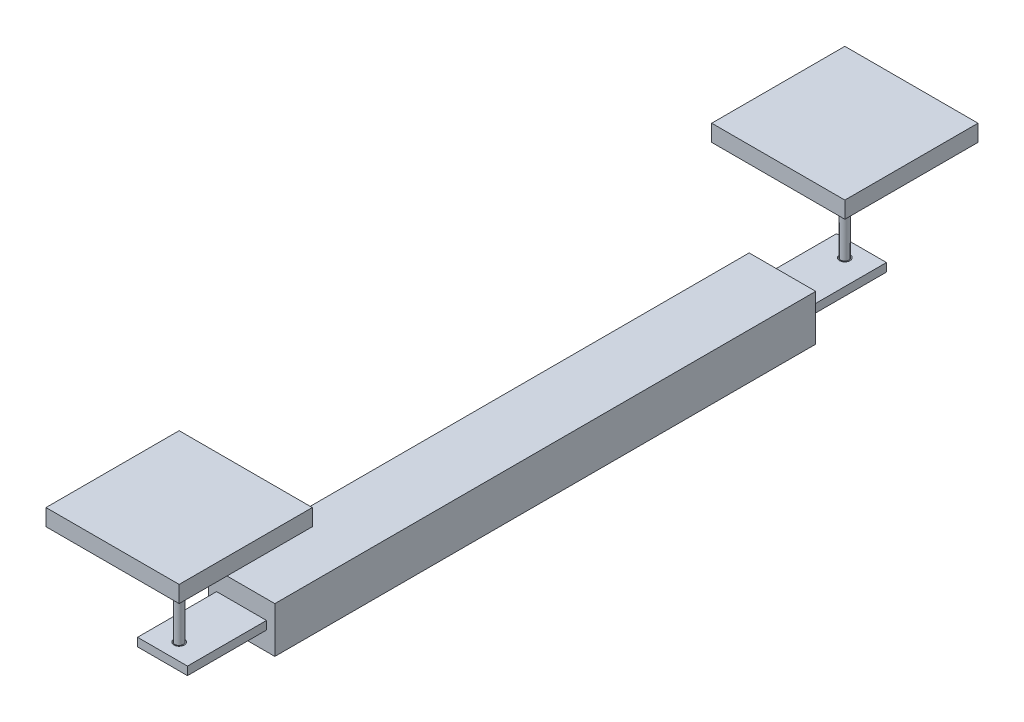
ISO-10303-21;
HEADER;
FILE_DESCRIPTION(('STEP AP214'),'2;1');
FILE_NAME('part.step','',(''),(''),'','','');
FILE_SCHEMA(('AUTOMOTIVE_DESIGN { 1 0 10303 214 1 1 1 1 }'));
ENDSEC;
DATA;
#1=APPLICATION_CONTEXT('core data for automotive mechanical design processes');
#2=APPLICATION_PROTOCOL_DEFINITION('international standard','automotive_design',2000,#1);
#3=PRODUCT_CONTEXT('',#1,'mechanical');
#4=PRODUCT('Part','Part','',(#3));
#5=PRODUCT_RELATED_PRODUCT_CATEGORY('part','',(#4));
#6=PRODUCT_DEFINITION_FORMATION('','',#4);
#7=PRODUCT_DEFINITION_CONTEXT('part definition',#1,'design');
#8=PRODUCT_DEFINITION('design','',#6,#7);
#9=PRODUCT_DEFINITION_SHAPE('','',#8);
#10=(LENGTH_UNIT() NAMED_UNIT(*) SI_UNIT(.MILLI.,.METRE.));
#11=(NAMED_UNIT(*) PLANE_ANGLE_UNIT() SI_UNIT($,.RADIAN.));
#12=(NAMED_UNIT(*) SI_UNIT($,.STERADIAN.) SOLID_ANGLE_UNIT());
#13=UNCERTAINTY_MEASURE_WITH_UNIT(LENGTH_MEASURE(1.E-05),#10,'distance_accuracy_value','');
#14=(GEOMETRIC_REPRESENTATION_CONTEXT(3) GLOBAL_UNCERTAINTY_ASSIGNED_CONTEXT((#13)) GLOBAL_UNIT_ASSIGNED_CONTEXT((#10,
#11,#12)) REPRESENTATION_CONTEXT('',''));
#15=CARTESIAN_POINT('',(0.,0.,0.));
#16=DIRECTION('',(0.,0.,1.));
#17=DIRECTION('',(1.,0.,0.));
#18=AXIS2_PLACEMENT_3D('',#15,#16,#17);
#19=CARTESIAN_POINT('',(0.,79.375,254.));
#20=DIRECTION('',(0.,-1.,0.));
#21=DIRECTION('',(0.,0.,-1.));
#22=AXIS2_PLACEMENT_3D('',#19,#20,#21);
#23=CYLINDRICAL_SURFACE('',#22,3.175);
#24=CARTESIAN_POINT('',(0.,79.375,254.));
#25=DIRECTION('',(0.,1.,0.));
#26=DIRECTION('',(0.,0.,1.));
#27=AXIS2_PLACEMENT_3D('',#24,#25,#26);
#28=CIRCLE('',#27,3.175);
#29=CARTESIAN_POINT('',(0.,79.375,250.825));
#30=VERTEX_POINT('',#29);
#31=EDGE_CURVE('E12',#30,#30,#28,.T.);
#32=CARTESIAN_POINT('',(0.,3.175,254.));
#33=DIRECTION('',(0.,1.,0.));
#34=DIRECTION('',(0.,0.,1.));
#35=AXIS2_PLACEMENT_3D('',#32,#33,#34);
#36=CIRCLE('',#35,3.175);
#37=CARTESIAN_POINT('',(0.,3.175,250.825));
#38=VERTEX_POINT('',#37);
#39=EDGE_CURVE('E53',#38,#38,#36,.T.);
#40=CARTESIAN_POINT('',(0.,79.375,250.825));
#41=CARTESIAN_POINT('',(0.,78.58125,250.825));
#42=CARTESIAN_POINT('',(0.,77.7875,250.825));
#43=CARTESIAN_POINT('',(0.,76.2,250.825));
#44=CARTESIAN_POINT('',(0.,75.40625,250.825));
#45=CARTESIAN_POINT('',(0.,73.81875,250.825));
#46=CARTESIAN_POINT('',(0.,73.025,250.825));
#47=CARTESIAN_POINT('',(0.,71.4375,250.825));
#48=CARTESIAN_POINT('',(0.,70.64375,250.825));
#49=CARTESIAN_POINT('',(0.,69.05625,250.825));
#50=CARTESIAN_POINT('',(0.,68.2625,250.825));
#51=CARTESIAN_POINT('',(0.,66.675,250.825));
#52=CARTESIAN_POINT('',(0.,65.88125,250.825));
#53=CARTESIAN_POINT('',(0.,64.29375,250.825));
#54=CARTESIAN_POINT('',(0.,63.5,250.825));
#55=CARTESIAN_POINT('',(0.,61.9125,250.825));
#56=CARTESIAN_POINT('',(0.,61.11875,250.825));
#57=CARTESIAN_POINT('',(0.,59.53125,250.825));
#58=CARTESIAN_POINT('',(0.,58.7375,250.825));
#59=CARTESIAN_POINT('',(0.,57.15,250.825));
#60=CARTESIAN_POINT('',(0.,56.35625,250.825));
#61=CARTESIAN_POINT('',(0.,54.76875,250.825));
#62=CARTESIAN_POINT('',(0.,53.975,250.825));
#63=CARTESIAN_POINT('',(0.,52.3875,250.825));
#64=CARTESIAN_POINT('',(0.,51.59375,250.825));
#65=CARTESIAN_POINT('',(0.,50.00625,250.825));
#66=CARTESIAN_POINT('',(0.,49.2125,250.825));
#67=CARTESIAN_POINT('',(0.,47.625,250.825));
#68=CARTESIAN_POINT('',(0.,46.83125,250.825));
#69=CARTESIAN_POINT('',(0.,45.24375,250.825));
#70=CARTESIAN_POINT('',(0.,44.45,250.825));
#71=CARTESIAN_POINT('',(0.,42.8625,250.825));
#72=CARTESIAN_POINT('',(0.,42.06875,250.825));
#73=CARTESIAN_POINT('',(0.,40.48125,250.825));
#74=CARTESIAN_POINT('',(0.,39.6875,250.825));
#75=CARTESIAN_POINT('',(0.,38.1,250.825));
#76=CARTESIAN_POINT('',(0.,37.30625,250.825));
#77=CARTESIAN_POINT('',(0.,35.71875,250.825));
#78=CARTESIAN_POINT('',(0.,34.925,250.825));
#79=CARTESIAN_POINT('',(0.,33.3375,250.825));
#80=CARTESIAN_POINT('',(0.,32.54375,250.825));
#81=CARTESIAN_POINT('',(0.,30.95625,250.825));
#82=CARTESIAN_POINT('',(0.,30.1625,250.825));
#83=CARTESIAN_POINT('',(0.,28.575,250.825));
#84=CARTESIAN_POINT('',(0.,27.78125,250.825));
#85=CARTESIAN_POINT('',(0.,26.19375,250.825));
#86=CARTESIAN_POINT('',(0.,25.4,250.825));
#87=CARTESIAN_POINT('',(0.,23.8125,250.825));
#88=CARTESIAN_POINT('',(0.,23.01875,250.825));
#89=CARTESIAN_POINT('',(0.,21.43125,250.825));
#90=CARTESIAN_POINT('',(0.,20.6375,250.825));
#91=CARTESIAN_POINT('',(0.,19.05,250.825));
#92=CARTESIAN_POINT('',(0.,18.25625,250.825));
#93=CARTESIAN_POINT('',(0.,16.66875,250.825));
#94=CARTESIAN_POINT('',(0.,15.875,250.825));
#95=CARTESIAN_POINT('',(0.,14.2875,250.825));
#96=CARTESIAN_POINT('',(0.,13.49375,250.825));
#97=CARTESIAN_POINT('',(0.,11.90625,250.825));
#98=CARTESIAN_POINT('',(0.,11.1125,250.825));
#99=CARTESIAN_POINT('',(0.,9.525,250.825));
#100=CARTESIAN_POINT('',(0.,8.73125,250.825));
#101=CARTESIAN_POINT('',(0.,7.14375,250.825));
#102=CARTESIAN_POINT('',(0.,6.35,250.825));
#103=CARTESIAN_POINT('',(0.,4.7625,250.825));
#104=CARTESIAN_POINT('',(0.,3.96875,250.825));
#105=CARTESIAN_POINT('',(0.,3.175,250.825));
#106=B_SPLINE_CURVE_WITH_KNOTS('',3,(#40,#41,#42,#43,#44,#45,#46,#47,#48,#49,#50,#51,#52,#53,
#54,#55,#56,#57,#58,#59,#60,#61,#62,#63,#64,#65,#66,#67,#68,#69,#70,#71,#72,#73,#74,#75,#76,#77,
#78,#79,#80,#81,#82,#83,#84,#85,#86,#87,#88,#89,#90,#91,#92,#93,#94,#95,#96,#97,#98,#99,#100,
#101,#102,#103,#104,#105),.UNSPECIFIED.,.F.,.F.,(4,2,2,2,2,2,2,2,2,2,2,2,2,2,2,2,2,2,2,2,2,2,2,
2,2,2,2,2,2,2,2,2,4),(0.,2.38125,4.7625,7.14375,9.52500000000001,11.90625,14.2875,16.66875,
19.05,21.43125,23.8125,26.19375,28.575,30.95625,33.3375,35.71875,38.1,40.48125,42.8625,45.24375,
47.625,50.00625,52.3875,54.76875,57.15,59.53125,61.9125,64.29375,66.675,69.05625,71.4375,
73.81875,76.2),.UNSPECIFIED.);
#107=EDGE_CURVE('BSEAM50',#30,#38,#106,.T.);
#108=ORIENTED_EDGE('',*,*,#31,.F.);
#109=ORIENTED_EDGE('',*,*,#39,.T.);
#110=ORIENTED_EDGE('',*,*,#107,.T.);
#111=ORIENTED_EDGE('',*,*,#107,.F.);
#112=EDGE_LOOP('',(#108,#110,#109,#111));
#113=FACE_BOUND('',#112,.T.);
#114=ADVANCED_FACE('F50',(#113),#23,.T.);
#115=CARTESIAN_POINT('',(0.,3.175,254.));
#116=DIRECTION('',(0.,1.,0.));
#117=DIRECTION('',(0.,0.,1.));
#118=AXIS2_PLACEMENT_3D('',#115,#116,#117);
#119=PLANE('',#118);
#120=ORIENTED_EDGE('',*,*,#39,.F.);
#121=EDGE_LOOP('',(#120));
#122=FACE_BOUND('',#121,.T.);
#123=ADVANCED_FACE('F129',(#122),#119,.F.);
#124=CARTESIAN_POINT('',(50.8,92.075,203.2));
#125=DIRECTION('',(-1.,0.,0.));
#126=DIRECTION('',(0.,0.,1.));
#127=AXIS2_PLACEMENT_3D('',#124,#125,#126);
#128=PLANE('',#127);
#129=DIRECTION('',(0.,0.,-1.));
#130=VECTOR('',#129,1.);
#131=CARTESIAN_POINT('',(50.8,79.375,203.2));
#132=LINE('',#131,#130);
#133=CARTESIAN_POINT('',(50.8,79.375,304.8));
#134=VERTEX_POINT('',#133);
#135=CARTESIAN_POINT('',(50.8,79.375,203.2));
#136=VERTEX_POINT('',#135);
#137=EDGE_CURVE('E117',#134,#136,#132,.T.);
#138=ORIENTED_EDGE('',*,*,#137,.T.);
#139=DIRECTION('',(0.,-1.,0.));
#140=VECTOR('',#139,1.);
#141=CARTESIAN_POINT('',(50.8,92.075,203.2));
#142=LINE('',#141,#140);
#143=CARTESIAN_POINT('',(50.8,92.075,203.2));
#144=VERTEX_POINT('',#143);
#145=EDGE_CURVE('E108',#144,#136,#142,.T.);
#146=ORIENTED_EDGE('',*,*,#145,.F.);
#147=DIRECTION('',(0.,0.,-1.));
#148=VECTOR('',#147,1.);
#149=CARTESIAN_POINT('',(50.8,92.075,203.2));
#150=LINE('',#149,#148);
#151=CARTESIAN_POINT('',(50.8,92.075,304.8));
#152=VERTEX_POINT('',#151);
#153=EDGE_CURVE('E102',#152,#144,#150,.T.);
#154=ORIENTED_EDGE('',*,*,#153,.F.);
#155=DIRECTION('',(0.,-1.,0.));
#156=VECTOR('',#155,1.);
#157=CARTESIAN_POINT('',(50.8,92.075,304.8));
#158=LINE('',#157,#156);
#159=EDGE_CURVE('E113',#152,#134,#158,.T.);
#160=ORIENTED_EDGE('',*,*,#159,.T.);
#161=EDGE_LOOP('',(#138,#146,#154,#160));
#162=FACE_BOUND('',#161,.T.);
#163=ADVANCED_FACE('F131',(#162),#128,.F.);
#164=CARTESIAN_POINT('',(-50.7999999999999,92.075,203.2));
#165=DIRECTION('',(0.,0.,1.));
#166=DIRECTION('',(1.,0.,0.));
#167=AXIS2_PLACEMENT_3D('',#164,#165,#166);
#168=PLANE('',#167);
#169=DIRECTION('',(-1.,0.,0.));
#170=VECTOR('',#169,1.);
#171=CARTESIAN_POINT('',(-50.7999999999999,79.375,203.2));
#172=LINE('',#171,#170);
#173=CARTESIAN_POINT('',(-50.7999999999999,79.375,203.2));
#174=VERTEX_POINT('',#173);
#175=EDGE_CURVE('E107',#136,#174,#172,.T.);
#176=ORIENTED_EDGE('',*,*,#175,.T.);
#177=DIRECTION('',(0.,-1.,0.));
#178=VECTOR('',#177,1.);
#179=CARTESIAN_POINT('',(-50.7999999999999,92.075,203.2));
#180=LINE('',#179,#178);
#181=CARTESIAN_POINT('',(-50.7999999999999,92.075,203.2));
#182=VERTEX_POINT('',#181);
#183=EDGE_CURVE('E105',#182,#174,#180,.T.);
#184=ORIENTED_EDGE('',*,*,#183,.F.);
#185=DIRECTION('',(-1.,0.,0.));
#186=VECTOR('',#185,1.);
#187=CARTESIAN_POINT('',(-50.7999999999999,92.075,203.2));
#188=LINE('',#187,#186);
#189=EDGE_CURVE('E97',#144,#182,#188,.T.);
#190=ORIENTED_EDGE('',*,*,#189,.F.);
#191=ORIENTED_EDGE('',*,*,#145,.T.);
#192=EDGE_LOOP('',(#176,#184,#190,#191));
#193=FACE_BOUND('',#192,.T.);
#194=ADVANCED_FACE('F106',(#193),#168,.F.);
#195=CARTESIAN_POINT('',(-50.7999999999999,92.075,203.2));
#196=DIRECTION('',(1.,0.,0.));
#197=DIRECTION('',(0.,0.,-1.));
#198=AXIS2_PLACEMENT_3D('',#195,#196,#197);
#199=PLANE('',#198);
#200=DIRECTION('',(0.,0.,1.));
#201=VECTOR('',#200,1.);
#202=CARTESIAN_POINT('',(-50.7999999999999,79.375,203.2));
#203=LINE('',#202,#201);
#204=CARTESIAN_POINT('',(-50.7999999999999,79.375,304.8));
#205=VERTEX_POINT('',#204);
#206=EDGE_CURVE('E83',#174,#205,#203,.T.);
#207=ORIENTED_EDGE('',*,*,#206,.T.);
#208=DIRECTION('',(0.,-1.,0.));
#209=VECTOR('',#208,1.);
#210=CARTESIAN_POINT('',(-50.7999999999999,92.075,304.8));
#211=LINE('',#210,#209);
#212=CARTESIAN_POINT('',(-50.7999999999999,92.075,304.8));
#213=VERTEX_POINT('',#212);
#214=EDGE_CURVE('E109',#213,#205,#211,.T.);
#215=ORIENTED_EDGE('',*,*,#214,.F.);
#216=DIRECTION('',(0.,0.,1.));
#217=VECTOR('',#216,1.);
#218=CARTESIAN_POINT('',(-50.7999999999999,92.075,203.2));
#219=LINE('',#218,#217);
#220=EDGE_CURVE('E100',#182,#213,#219,.T.);
#221=ORIENTED_EDGE('',*,*,#220,.F.);
#222=ORIENTED_EDGE('',*,*,#183,.T.);
#223=EDGE_LOOP('',(#207,#215,#221,#222));
#224=FACE_BOUND('',#223,.T.);
#225=ADVANCED_FACE('F111',(#224),#199,.F.);
#226=CARTESIAN_POINT('',(-50.7999999999999,92.075,304.8));
#227=DIRECTION('',(0.,0.,-1.));
#228=DIRECTION('',(-1.,0.,0.));
#229=AXIS2_PLACEMENT_3D('',#226,#227,#228);
#230=PLANE('',#229);
#231=DIRECTION('',(1.,0.,0.));
#232=VECTOR('',#231,1.);
#233=CARTESIAN_POINT('',(-50.7999999999999,79.375,304.8));
#234=LINE('',#233,#232);
#235=EDGE_CURVE('E89',#205,#134,#234,.T.);
#236=ORIENTED_EDGE('',*,*,#235,.T.);
#237=ORIENTED_EDGE('',*,*,#159,.F.);
#238=DIRECTION('',(1.,0.,0.));
#239=VECTOR('',#238,1.);
#240=CARTESIAN_POINT('',(-50.7999999999999,92.075,304.8));
#241=LINE('',#240,#239);
#242=EDGE_CURVE('E66',#213,#152,#241,.T.);
#243=ORIENTED_EDGE('',*,*,#242,.F.);
#244=ORIENTED_EDGE('',*,*,#214,.T.);
#245=EDGE_LOOP('',(#236,#237,#243,#244));
#246=FACE_BOUND('',#245,.T.);
#247=ADVANCED_FACE('F144',(#246),#230,.F.);
#248=CARTESIAN_POINT('',(0.,92.075,0.));
#249=DIRECTION('',(0.,1.,0.));
#250=DIRECTION('',(0.,0.,1.));
#251=AXIS2_PLACEMENT_3D('',#248,#249,#250);
#252=PLANE('',#251);
#253=ORIENTED_EDGE('',*,*,#153,.T.);
#254=ORIENTED_EDGE('',*,*,#189,.T.);
#255=ORIENTED_EDGE('',*,*,#220,.T.);
#256=ORIENTED_EDGE('',*,*,#242,.T.);
#257=EDGE_LOOP('',(#253,#254,#255,#256));
#258=FACE_BOUND('',#257,.T.);
#259=ADVANCED_FACE('F98',(#258),#252,.T.);
#260=CARTESIAN_POINT('',(0.,79.375,0.));
#261=DIRECTION('',(0.,1.,0.));
#262=DIRECTION('',(0.,0.,1.));
#263=AXIS2_PLACEMENT_3D('',#260,#261,#262);
#264=PLANE('',#263);
#265=ORIENTED_EDGE('',*,*,#31,.T.);
#266=EDGE_LOOP('',(#265));
#267=FACE_BOUND('',#266,.T.);
#268=ORIENTED_EDGE('',*,*,#137,.F.);
#269=ORIENTED_EDGE('',*,*,#235,.F.);
#270=ORIENTED_EDGE('',*,*,#206,.F.);
#271=ORIENTED_EDGE('',*,*,#175,.F.);
#272=EDGE_LOOP('',(#268,#269,#270,#271));
#273=FACE_BOUND('',#272,.T.);
#274=ADVANCED_FACE('F147',(#267,#273),#264,.F.);
#275=CLOSED_SHELL('',(#114,#123,#163,#194,#225,#247,#259,#274));
#276=MANIFOLD_SOLID_BREP('B2',#275);
#277=CARTESIAN_POINT('',(0.,79.375,-254.));
#278=DIRECTION('',(0.,-1.,0.));
#279=DIRECTION('',(0.,0.,-1.));
#280=AXIS2_PLACEMENT_3D('',#277,#278,#279);
#281=CYLINDRICAL_SURFACE('',#280,3.175);
#282=CARTESIAN_POINT('',(0.,79.375,-254.));
#283=DIRECTION('',(0.,1.,0.));
#284=DIRECTION('',(0.,0.,1.));
#285=AXIS2_PLACEMENT_3D('',#282,#283,#284);
#286=CIRCLE('',#285,3.175);
#287=CARTESIAN_POINT('',(0.,79.375,-257.175));
#288=VERTEX_POINT('',#287);
#289=EDGE_CURVE('E48',#288,#288,#286,.T.);
#290=CARTESIAN_POINT('',(0.,3.175,-254.));
#291=DIRECTION('',(0.,1.,0.));
#292=DIRECTION('',(0.,0.,1.));
#293=AXIS2_PLACEMENT_3D('',#290,#291,#292);
#294=CIRCLE('',#293,3.175);
#295=CARTESIAN_POINT('',(0.,3.175,-257.175));
#296=VERTEX_POINT('',#295);
#297=EDGE_CURVE('E216',#296,#296,#294,.T.);
#298=CARTESIAN_POINT('',(0.,79.375,-257.175));
#299=CARTESIAN_POINT('',(0.,78.58125,-257.175));
#300=CARTESIAN_POINT('',(0.,77.7875,-257.175));
#301=CARTESIAN_POINT('',(0.,76.2,-257.175));
#302=CARTESIAN_POINT('',(0.,75.40625,-257.175));
#303=CARTESIAN_POINT('',(0.,73.81875,-257.175));
#304=CARTESIAN_POINT('',(0.,73.025,-257.175));
#305=CARTESIAN_POINT('',(0.,71.4375,-257.175));
#306=CARTESIAN_POINT('',(0.,70.64375,-257.175));
#307=CARTESIAN_POINT('',(0.,69.05625,-257.175));
#308=CARTESIAN_POINT('',(0.,68.2625,-257.175));
#309=CARTESIAN_POINT('',(0.,66.675,-257.175));
#310=CARTESIAN_POINT('',(0.,65.88125,-257.175));
#311=CARTESIAN_POINT('',(0.,64.29375,-257.175));
#312=CARTESIAN_POINT('',(0.,63.5,-257.175));
#313=CARTESIAN_POINT('',(0.,61.9125,-257.175));
#314=CARTESIAN_POINT('',(0.,61.11875,-257.175));
#315=CARTESIAN_POINT('',(0.,59.53125,-257.175));
#316=CARTESIAN_POINT('',(0.,58.7375,-257.175));
#317=CARTESIAN_POINT('',(0.,57.15,-257.175));
#318=CARTESIAN_POINT('',(0.,56.35625,-257.175));
#319=CARTESIAN_POINT('',(0.,54.76875,-257.175));
#320=CARTESIAN_POINT('',(0.,53.975,-257.175));
#321=CARTESIAN_POINT('',(0.,52.3875,-257.175));
#322=CARTESIAN_POINT('',(0.,51.59375,-257.175));
#323=CARTESIAN_POINT('',(0.,50.00625,-257.175));
#324=CARTESIAN_POINT('',(0.,49.2125,-257.175));
#325=CARTESIAN_POINT('',(0.,47.625,-257.175));
#326=CARTESIAN_POINT('',(0.,46.83125,-257.175));
#327=CARTESIAN_POINT('',(0.,45.24375,-257.175));
#328=CARTESIAN_POINT('',(0.,44.45,-257.175));
#329=CARTESIAN_POINT('',(0.,42.8625,-257.175));
#330=CARTESIAN_POINT('',(0.,42.06875,-257.175));
#331=CARTESIAN_POINT('',(0.,40.48125,-257.175));
#332=CARTESIAN_POINT('',(0.,39.6875,-257.175));
#333=CARTESIAN_POINT('',(0.,38.1,-257.175));
#334=CARTESIAN_POINT('',(0.,37.30625,-257.175));
#335=CARTESIAN_POINT('',(0.,35.71875,-257.175));
#336=CARTESIAN_POINT('',(0.,34.925,-257.175));
#337=CARTESIAN_POINT('',(0.,33.3375,-257.175));
#338=CARTESIAN_POINT('',(0.,32.54375,-257.175));
#339=CARTESIAN_POINT('',(0.,30.95625,-257.175));
#340=CARTESIAN_POINT('',(0.,30.1625,-257.175));
#341=CARTESIAN_POINT('',(0.,28.575,-257.175));
#342=CARTESIAN_POINT('',(0.,27.78125,-257.175));
#343=CARTESIAN_POINT('',(0.,26.19375,-257.175));
#344=CARTESIAN_POINT('',(0.,25.4,-257.175));
#345=CARTESIAN_POINT('',(0.,23.8125,-257.175));
#346=CARTESIAN_POINT('',(0.,23.01875,-257.175));
#347=CARTESIAN_POINT('',(0.,21.43125,-257.175));
#348=CARTESIAN_POINT('',(0.,20.6375,-257.175));
#349=CARTESIAN_POINT('',(0.,19.05,-257.175));
#350=CARTESIAN_POINT('',(0.,18.25625,-257.175));
#351=CARTESIAN_POINT('',(0.,16.66875,-257.175));
#352=CARTESIAN_POINT('',(0.,15.875,-257.175));
#353=CARTESIAN_POINT('',(0.,14.2875,-257.175));
#354=CARTESIAN_POINT('',(0.,13.49375,-257.175));
#355=CARTESIAN_POINT('',(0.,11.90625,-257.175));
#356=CARTESIAN_POINT('',(0.,11.1125,-257.175));
#357=CARTESIAN_POINT('',(0.,9.525,-257.175));
#358=CARTESIAN_POINT('',(0.,8.73125,-257.175));
#359=CARTESIAN_POINT('',(0.,7.14375,-257.175));
#360=CARTESIAN_POINT('',(0.,6.35,-257.175));
#361=CARTESIAN_POINT('',(0.,4.7625,-257.175));
#362=CARTESIAN_POINT('',(0.,3.96875,-257.175));
#363=CARTESIAN_POINT('',(0.,3.175,-257.175));
#364=B_SPLINE_CURVE_WITH_KNOTS('',3,(#298,#299,#300,#301,#302,#303,#304,#305,#306,#307,#308,
#309,#310,#311,#312,#313,#314,#315,#316,#317,#318,#319,#320,#321,#322,#323,#324,#325,#326,#327,
#328,#329,#330,#331,#332,#333,#334,#335,#336,#337,#338,#339,#340,#341,#342,#343,#344,#345,#346,
#347,#348,#349,#350,#351,#352,#353,#354,#355,#356,#357,#358,#359,#360,#361,#362,#363),
.UNSPECIFIED.,.F.,.F.,(4,2,2,2,2,2,2,2,2,2,2,2,2,2,2,2,2,2,2,2,2,2,2,2,2,2,2,2,2,2,2,2,4),(0.,
2.38125,4.7625,7.14375,9.52500000000001,11.90625,14.2875,16.66875,19.05,21.43125,23.8125,
26.19375,28.575,30.95625,33.3375,35.71875,38.1,40.48125,42.8625,45.24375,47.625,50.00625,
52.3875,54.76875,57.15,59.53125,61.9125,64.29375,66.675,69.05625,71.4375,73.81875,76.2),.UNSPECIFIED.);
#365=EDGE_CURVE('BSEAM213',#288,#296,#364,.T.);
#366=ORIENTED_EDGE('',*,*,#289,.F.);
#367=ORIENTED_EDGE('',*,*,#297,.T.);
#368=ORIENTED_EDGE('',*,*,#365,.T.);
#369=ORIENTED_EDGE('',*,*,#365,.F.);
#370=EDGE_LOOP('',(#366,#368,#367,#369));
#371=FACE_BOUND('',#370,.T.);
#372=ADVANCED_FACE('F213',(#371),#281,.T.);
#373=CARTESIAN_POINT('',(0.,3.175,-254.));
#374=DIRECTION('',(0.,1.,0.));
#375=DIRECTION('',(0.,0.,1.));
#376=AXIS2_PLACEMENT_3D('',#373,#374,#375);
#377=PLANE('',#376);
#378=ORIENTED_EDGE('',*,*,#297,.F.);
#379=EDGE_LOOP('',(#378));
#380=FACE_BOUND('',#379,.T.);
#381=ADVANCED_FACE('F292',(#380),#377,.F.);
#382=CARTESIAN_POINT('',(50.8,92.075,-304.8));
#383=DIRECTION('',(-1.,0.,0.));
#384=DIRECTION('',(0.,0.,1.));
#385=AXIS2_PLACEMENT_3D('',#382,#383,#384);
#386=PLANE('',#385);
#387=DIRECTION('',(0.,0.,-1.));
#388=VECTOR('',#387,1.);
#389=CARTESIAN_POINT('',(50.8,79.375,-304.8));
#390=LINE('',#389,#388);
#391=CARTESIAN_POINT('',(50.8,79.375,-203.2));
#392=VERTEX_POINT('',#391);
#393=CARTESIAN_POINT('',(50.8,79.375,-304.8));
#394=VERTEX_POINT('',#393);
#395=EDGE_CURVE('E280',#392,#394,#390,.T.);
#396=ORIENTED_EDGE('',*,*,#395,.T.);
#397=DIRECTION('',(0.,-1.,0.));
#398=VECTOR('',#397,1.);
#399=CARTESIAN_POINT('',(50.8,92.075,-304.8));
#400=LINE('',#399,#398);
#401=CARTESIAN_POINT('',(50.8,92.075,-304.8));
#402=VERTEX_POINT('',#401);
#403=EDGE_CURVE('E271',#402,#394,#400,.T.);
#404=ORIENTED_EDGE('',*,*,#403,.F.);
#405=DIRECTION('',(0.,0.,-1.));
#406=VECTOR('',#405,1.);
#407=CARTESIAN_POINT('',(50.8,92.075,-304.8));
#408=LINE('',#407,#406);
#409=CARTESIAN_POINT('',(50.8,92.075,-203.2));
#410=VERTEX_POINT('',#409);
#411=EDGE_CURVE('E265',#410,#402,#408,.T.);
#412=ORIENTED_EDGE('',*,*,#411,.F.);
#413=DIRECTION('',(0.,-1.,0.));
#414=VECTOR('',#413,1.);
#415=CARTESIAN_POINT('',(50.8,92.075,-203.2));
#416=LINE('',#415,#414);
#417=EDGE_CURVE('E276',#410,#392,#416,.T.);
#418=ORIENTED_EDGE('',*,*,#417,.T.);
#419=EDGE_LOOP('',(#396,#404,#412,#418));
#420=FACE_BOUND('',#419,.T.);
#421=ADVANCED_FACE('F294',(#420),#386,.F.);
#422=CARTESIAN_POINT('',(-50.8,92.075,-304.8));
#423=DIRECTION('',(0.,0.,1.));
#424=DIRECTION('',(1.,0.,0.));
#425=AXIS2_PLACEMENT_3D('',#422,#423,#424);
#426=PLANE('',#425);
#427=DIRECTION('',(-1.,0.,0.));
#428=VECTOR('',#427,1.);
#429=CARTESIAN_POINT('',(-50.8,79.375,-304.8));
#430=LINE('',#429,#428);
#431=CARTESIAN_POINT('',(-50.8,79.375,-304.8));
#432=VERTEX_POINT('',#431);
#433=EDGE_CURVE('E270',#394,#432,#430,.T.);
#434=ORIENTED_EDGE('',*,*,#433,.T.);
#435=DIRECTION('',(0.,-1.,0.));
#436=VECTOR('',#435,1.);
#437=CARTESIAN_POINT('',(-50.8,92.075,-304.8));
#438=LINE('',#437,#436);
#439=CARTESIAN_POINT('',(-50.8,92.075,-304.8));
#440=VERTEX_POINT('',#439);
#441=EDGE_CURVE('E268',#440,#432,#438,.T.);
#442=ORIENTED_EDGE('',*,*,#441,.F.);
#443=DIRECTION('',(-1.,0.,0.));
#444=VECTOR('',#443,1.);
#445=CARTESIAN_POINT('',(-50.8,92.075,-304.8));
#446=LINE('',#445,#444);
#447=EDGE_CURVE('E260',#402,#440,#446,.T.);
#448=ORIENTED_EDGE('',*,*,#447,.F.);
#449=ORIENTED_EDGE('',*,*,#403,.T.);
#450=EDGE_LOOP('',(#434,#442,#448,#449));
#451=FACE_BOUND('',#450,.T.);
#452=ADVANCED_FACE('F269',(#451),#426,.F.);
#453=CARTESIAN_POINT('',(-50.8,92.075,-304.8));
#454=DIRECTION('',(1.,0.,0.));
#455=DIRECTION('',(0.,0.,-1.));
#456=AXIS2_PLACEMENT_3D('',#453,#454,#455);
#457=PLANE('',#456);
#458=DIRECTION('',(0.,0.,1.));
#459=VECTOR('',#458,1.);
#460=CARTESIAN_POINT('',(-50.8,79.375,-304.8));
#461=LINE('',#460,#459);
#462=CARTESIAN_POINT('',(-50.8,79.375,-203.2));
#463=VERTEX_POINT('',#462);
#464=EDGE_CURVE('E246',#432,#463,#461,.T.);
#465=ORIENTED_EDGE('',*,*,#464,.T.);
#466=DIRECTION('',(0.,-1.,0.));
#467=VECTOR('',#466,1.);
#468=CARTESIAN_POINT('',(-50.8,92.075,-203.2));
#469=LINE('',#468,#467);
#470=CARTESIAN_POINT('',(-50.8,92.075,-203.2));
#471=VERTEX_POINT('',#470);
#472=EDGE_CURVE('E272',#471,#463,#469,.T.);
#473=ORIENTED_EDGE('',*,*,#472,.F.);
#474=DIRECTION('',(0.,0.,1.));
#475=VECTOR('',#474,1.);
#476=CARTESIAN_POINT('',(-50.8,92.075,-304.8));
#477=LINE('',#476,#475);
#478=EDGE_CURVE('E263',#440,#471,#477,.T.);
#479=ORIENTED_EDGE('',*,*,#478,.F.);
#480=ORIENTED_EDGE('',*,*,#441,.T.);
#481=EDGE_LOOP('',(#465,#473,#479,#480));
#482=FACE_BOUND('',#481,.T.);
#483=ADVANCED_FACE('F274',(#482),#457,.F.);
#484=CARTESIAN_POINT('',(-50.8,92.075,-203.2));
#485=DIRECTION('',(0.,0.,-1.));
#486=DIRECTION('',(-1.,0.,0.));
#487=AXIS2_PLACEMENT_3D('',#484,#485,#486);
#488=PLANE('',#487);
#489=DIRECTION('',(1.,0.,0.));
#490=VECTOR('',#489,1.);
#491=CARTESIAN_POINT('',(-50.8,79.375,-203.2));
#492=LINE('',#491,#490);
#493=EDGE_CURVE('E252',#463,#392,#492,.T.);
#494=ORIENTED_EDGE('',*,*,#493,.T.);
#495=ORIENTED_EDGE('',*,*,#417,.F.);
#496=DIRECTION('',(1.,0.,0.));
#497=VECTOR('',#496,1.);
#498=CARTESIAN_POINT('',(-50.8,92.075,-203.2));
#499=LINE('',#498,#497);
#500=EDGE_CURVE('E229',#471,#410,#499,.T.);
#501=ORIENTED_EDGE('',*,*,#500,.F.);
#502=ORIENTED_EDGE('',*,*,#472,.T.);
#503=EDGE_LOOP('',(#494,#495,#501,#502));
#504=FACE_BOUND('',#503,.T.);
#505=ADVANCED_FACE('F307',(#504),#488,.F.);
#506=CARTESIAN_POINT('',(0.,92.075,0.));
#507=DIRECTION('',(0.,1.,0.));
#508=DIRECTION('',(0.,0.,1.));
#509=AXIS2_PLACEMENT_3D('',#506,#507,#508);
#510=PLANE('',#509);
#511=ORIENTED_EDGE('',*,*,#411,.T.);
#512=ORIENTED_EDGE('',*,*,#447,.T.);
#513=ORIENTED_EDGE('',*,*,#478,.T.);
#514=ORIENTED_EDGE('',*,*,#500,.T.);
#515=EDGE_LOOP('',(#511,#512,#513,#514));
#516=FACE_BOUND('',#515,.T.);
#517=ADVANCED_FACE('F261',(#516),#510,.T.);
#518=CARTESIAN_POINT('',(0.,79.375,0.));
#519=DIRECTION('',(0.,1.,0.));
#520=DIRECTION('',(0.,0.,1.));
#521=AXIS2_PLACEMENT_3D('',#518,#519,#520);
#522=PLANE('',#521);
#523=ORIENTED_EDGE('',*,*,#289,.T.);
#524=EDGE_LOOP('',(#523));
#525=FACE_BOUND('',#524,.T.);
#526=ORIENTED_EDGE('',*,*,#395,.F.);
#527=ORIENTED_EDGE('',*,*,#493,.F.);
#528=ORIENTED_EDGE('',*,*,#464,.F.);
#529=ORIENTED_EDGE('',*,*,#433,.F.);
#530=EDGE_LOOP('',(#526,#527,#528,#529));
#531=FACE_BOUND('',#530,.T.);
#532=ADVANCED_FACE('F310',(#525,#531),#522,.F.);
#533=CLOSED_SHELL('',(#372,#381,#421,#452,#483,#505,#517,#532));
#534=MANIFOLD_SOLID_BREP('B6',#533);
#535=CARTESIAN_POINT('',(19.05,3.175,266.7));
#536=DIRECTION('',(0.,-1.,0.));
#537=DIRECTION('',(0.,0.,-1.));
#538=AXIS2_PLACEMENT_3D('',#535,#536,#537);
#539=PLANE('',#538);
#540=CARTESIAN_POINT('',(0.,3.175,-254.));
#541=DIRECTION('',(0.,1.,0.));
#542=DIRECTION('',(0.,0.,1.));
#543=AXIS2_PLACEMENT_3D('',#540,#541,#542);
#544=CIRCLE('',#543,3.96875000000001);
#545=CARTESIAN_POINT('',(0.,3.175,-250.03125));
#546=VERTEX_POINT('',#545);
#547=EDGE_CURVE('E630',#546,#546,#544,.T.);
#548=ORIENTED_EDGE('',*,*,#547,.F.);
#549=EDGE_LOOP('',(#548));
#550=FACE_BOUND('',#549,.T.);
#551=DIRECTION('',(-1.,0.,0.));
#552=VECTOR('',#551,1.);
#553=CARTESIAN_POINT('',(19.05,3.175,-206.375));
#554=LINE('',#553,#552);
#555=CARTESIAN_POINT('',(19.05,3.175,-206.375));
#556=VERTEX_POINT('',#555);
#557=CARTESIAN_POINT('',(-19.05,3.175,-206.375));
#558=VERTEX_POINT('',#557);
#559=EDGE_CURVE('E507',#556,#558,#554,.T.);
#560=ORIENTED_EDGE('',*,*,#559,.F.);
#561=DIRECTION('',(0.,0.,1.));
#562=VECTOR('',#561,1.);
#563=CARTESIAN_POINT('',(19.05,3.175,266.7));
#564=LINE('',#563,#562);
#565=CARTESIAN_POINT('',(19.05,3.175,-266.7));
#566=VERTEX_POINT('',#565);
#567=EDGE_CURVE('E520',#566,#556,#564,.T.);
#568=ORIENTED_EDGE('',*,*,#567,.F.);
#569=DIRECTION('',(-1.,0.,0.));
#570=VECTOR('',#569,1.);
#571=CARTESIAN_POINT('',(19.05,3.175,-266.7));
#572=LINE('',#571,#570);
#573=CARTESIAN_POINT('',(-19.05,3.175,-266.7));
#574=VERTEX_POINT('',#573);
#575=EDGE_CURVE('E556',#566,#574,#572,.T.);
#576=ORIENTED_EDGE('',*,*,#575,.T.);
#577=DIRECTION('',(0.,0.,1.));
#578=VECTOR('',#577,1.);
#579=CARTESIAN_POINT('',(-19.05,3.175,266.7));
#580=LINE('',#579,#578);
#581=EDGE_CURVE('E535',#574,#558,#580,.T.);
#582=ORIENTED_EDGE('',*,*,#581,.T.);
#583=EDGE_LOOP('',(#560,#568,#576,#582));
#584=FACE_BOUND('',#583,.T.);
#585=ADVANCED_FACE('F366',(#550,#584),#539,.F.);
#586=CARTESIAN_POINT('',(19.05,-3.175,266.7));
#587=DIRECTION('',(0.,1.,0.));
#588=DIRECTION('',(0.,0.,1.));
#589=AXIS2_PLACEMENT_3D('',#586,#587,#588);
#590=PLANE('',#589);
#591=CARTESIAN_POINT('',(0.,-3.175,-254.));
#592=DIRECTION('',(0.,1.,0.));
#593=DIRECTION('',(0.,0.,1.));
#594=AXIS2_PLACEMENT_3D('',#591,#592,#593);
#595=CIRCLE('',#594,3.96875000000001);
#596=CARTESIAN_POINT('',(0.,-3.175,-250.03125));
#597=VERTEX_POINT('',#596);
#598=EDGE_CURVE('E370',#597,#597,#595,.T.);
#599=ORIENTED_EDGE('',*,*,#598,.T.);
#600=EDGE_LOOP('',(#599));
#601=FACE_BOUND('',#600,.T.);
#602=DIRECTION('',(1.,0.,0.));
#603=VECTOR('',#602,1.);
#604=CARTESIAN_POINT('',(19.05,-3.175,-206.375));
#605=LINE('',#604,#603);
#606=CARTESIAN_POINT('',(-19.05,-3.175,-206.375));
#607=VERTEX_POINT('',#606);
#608=CARTESIAN_POINT('',(19.05,-3.175,-206.375));
#609=VERTEX_POINT('',#608);
#610=EDGE_CURVE('E503',#607,#609,#605,.T.);
#611=ORIENTED_EDGE('',*,*,#610,.F.);
#612=DIRECTION('',(0.,0.,-1.));
#613=VECTOR('',#612,1.);
#614=CARTESIAN_POINT('',(-19.05,-3.175,266.7));
#615=LINE('',#614,#613);
#616=CARTESIAN_POINT('',(-19.05,-3.175,-266.7));
#617=VERTEX_POINT('',#616);
#618=EDGE_CURVE('E542',#607,#617,#615,.T.);
#619=ORIENTED_EDGE('',*,*,#618,.T.);
#620=DIRECTION('',(-1.,0.,0.));
#621=VECTOR('',#620,1.);
#622=CARTESIAN_POINT('',(19.05,-3.175,-266.7));
#623=LINE('',#622,#621);
#624=CARTESIAN_POINT('',(19.05,-3.175,-266.7));
#625=VERTEX_POINT('',#624);
#626=EDGE_CURVE('E530',#625,#617,#623,.T.);
#627=ORIENTED_EDGE('',*,*,#626,.F.);
#628=DIRECTION('',(0.,0.,-1.));
#629=VECTOR('',#628,1.);
#630=CARTESIAN_POINT('',(19.05,-3.175,266.7));
#631=LINE('',#630,#629);
#632=EDGE_CURVE('E526',#609,#625,#631,.T.);
#633=ORIENTED_EDGE('',*,*,#632,.F.);
#634=EDGE_LOOP('',(#611,#619,#627,#633));
#635=FACE_BOUND('',#634,.T.);
#636=ADVANCED_FACE('F590',(#601,#635),#590,.F.);
#637=CARTESIAN_POINT('',(19.05,0.,0.));
#638=DIRECTION('',(1.,0.,0.));
#639=DIRECTION('',(0.,0.,-1.));
#640=AXIS2_PLACEMENT_3D('',#637,#638,#639);
#641=PLANE('',#640);
#642=ORIENTED_EDGE('',*,*,#567,.T.);
#643=DIRECTION('',(0.,-1.,0.));
#644=VECTOR('',#643,1.);
#645=CARTESIAN_POINT('',(19.05,0.,-206.375));
#646=LINE('',#645,#644);
#647=EDGE_CURVE('E383',#556,#609,#646,.T.);
#648=ORIENTED_EDGE('',*,*,#647,.T.);
#649=ORIENTED_EDGE('',*,*,#632,.T.);
#650=DIRECTION('',(0.,1.,0.));
#651=VECTOR('',#650,1.);
#652=CARTESIAN_POINT('',(19.05,3.175,-266.7));
#653=LINE('',#652,#651);
#654=EDGE_CURVE('E514',#625,#566,#653,.T.);
#655=ORIENTED_EDGE('',*,*,#654,.T.);
#656=EDGE_LOOP('',(#642,#648,#649,#655));
#657=FACE_BOUND('',#656,.T.);
#658=ADVANCED_FACE('F585',(#657),#641,.T.);
#659=CARTESIAN_POINT('',(-19.05,0.,0.));
#660=DIRECTION('',(1.,0.,0.));
#661=DIRECTION('',(0.,0.,-1.));
#662=AXIS2_PLACEMENT_3D('',#659,#660,#661);
#663=PLANE('',#662);
#664=DIRECTION('',(0.,-1.,0.));
#665=VECTOR('',#664,1.);
#666=CARTESIAN_POINT('',(-19.05,0.,-206.375));
#667=LINE('',#666,#665);
#668=EDGE_CURVE('E211',#558,#607,#667,.T.);
#669=ORIENTED_EDGE('',*,*,#668,.F.);
#670=ORIENTED_EDGE('',*,*,#581,.F.);
#671=DIRECTION('',(0.,1.,0.));
#672=VECTOR('',#671,1.);
#673=CARTESIAN_POINT('',(-19.05,3.175,-266.7));
#674=LINE('',#673,#672);
#675=EDGE_CURVE('E513',#617,#574,#674,.T.);
#676=ORIENTED_EDGE('',*,*,#675,.F.);
#677=ORIENTED_EDGE('',*,*,#618,.F.);
#678=EDGE_LOOP('',(#669,#670,#676,#677));
#679=FACE_BOUND('',#678,.T.);
#680=ADVANCED_FACE('F596',(#679),#663,.F.);
#681=CARTESIAN_POINT('',(19.05,3.175,-266.7));
#682=DIRECTION('',(0.,0.,1.));
#683=DIRECTION('',(1.,0.,0.));
#684=AXIS2_PLACEMENT_3D('',#681,#682,#683);
#685=PLANE('',#684);
#686=ORIENTED_EDGE('',*,*,#675,.T.);
#687=ORIENTED_EDGE('',*,*,#575,.F.);
#688=ORIENTED_EDGE('',*,*,#654,.F.);
#689=ORIENTED_EDGE('',*,*,#626,.T.);
#690=EDGE_LOOP('',(#686,#687,#688,#689));
#691=FACE_BOUND('',#690,.T.);
#692=ADVANCED_FACE('F368',(#691),#685,.F.);
#693=CARTESIAN_POINT('',(25.4,17.4625,-206.375));
#694=DIRECTION('',(0.,0.,1.));
#695=DIRECTION('',(1.,0.,0.));
#696=AXIS2_PLACEMENT_3D('',#693,#694,#695);
#697=PLANE('',#696);
#698=ORIENTED_EDGE('',*,*,#647,.F.);
#699=ORIENTED_EDGE('',*,*,#559,.T.);
#700=ORIENTED_EDGE('',*,*,#668,.T.);
#701=ORIENTED_EDGE('',*,*,#610,.T.);
#702=EDGE_LOOP('',(#698,#699,#700,#701));
#703=FACE_BOUND('',#702,.T.);
#704=DIRECTION('',(0.,1.,0.));
#705=VECTOR('',#704,1.);
#706=CARTESIAN_POINT('',(-25.4,17.4625,-206.375));
#707=LINE('',#706,#705);
#708=CARTESIAN_POINT('',(-25.4,-17.4625,-206.375));
#709=VERTEX_POINT('',#708);
#710=CARTESIAN_POINT('',(-25.4,17.4625,-206.375));
#711=VERTEX_POINT('',#710);
#712=EDGE_CURVE('E486',#709,#711,#707,.T.);
#713=ORIENTED_EDGE('',*,*,#712,.T.);
#714=DIRECTION('',(-1.,0.,0.));
#715=VECTOR('',#714,1.);
#716=CARTESIAN_POINT('',(25.4,17.4625,-206.375));
#717=LINE('',#716,#715);
#718=CARTESIAN_POINT('',(25.4,17.4625,-206.375));
#719=VERTEX_POINT('',#718);
#720=EDGE_CURVE('E464',#719,#711,#717,.T.);
#721=ORIENTED_EDGE('',*,*,#720,.F.);
#722=DIRECTION('',(0.,1.,0.));
#723=VECTOR('',#722,1.);
#724=CARTESIAN_POINT('',(25.4,17.4625,-206.375));
#725=LINE('',#724,#723);
#726=CARTESIAN_POINT('',(25.4,-17.4625,-206.375));
#727=VERTEX_POINT('',#726);
#728=EDGE_CURVE('E472',#727,#719,#725,.T.);
#729=ORIENTED_EDGE('',*,*,#728,.F.);
#730=DIRECTION('',(-1.,0.,0.));
#731=VECTOR('',#730,1.);
#732=CARTESIAN_POINT('',(25.4,-17.4625,-206.375));
#733=LINE('',#732,#731);
#734=EDGE_CURVE('E644',#727,#709,#733,.T.);
#735=ORIENTED_EDGE('',*,*,#734,.T.);
#736=EDGE_LOOP('',(#713,#721,#729,#735));
#737=FACE_BOUND('',#736,.T.);
#738=ADVANCED_FACE('F484',(#703,#737),#697,.F.);
#739=CARTESIAN_POINT('',(25.4,17.4625,206.375));
#740=DIRECTION('',(0.,-1.,0.));
#741=DIRECTION('',(0.,0.,-1.));
#742=AXIS2_PLACEMENT_3D('',#739,#740,#741);
#743=PLANE('',#742);
#744=DIRECTION('',(0.,0.,1.));
#745=VECTOR('',#744,1.);
#746=CARTESIAN_POINT('',(-25.4,17.4625,206.375));
#747=LINE('',#746,#745);
#748=CARTESIAN_POINT('',(-25.4,17.4625,206.375));
#749=VERTEX_POINT('',#748);
#750=EDGE_CURVE('E647',#711,#749,#747,.T.);
#751=ORIENTED_EDGE('',*,*,#750,.T.);
#752=DIRECTION('',(-1.,0.,0.));
#753=VECTOR('',#752,1.);
#754=CARTESIAN_POINT('',(25.4,17.4625,206.375));
#755=LINE('',#754,#753);
#756=CARTESIAN_POINT('',(25.4,17.4625,206.375));
#757=VERTEX_POINT('',#756);
#758=EDGE_CURVE('E467',#757,#749,#755,.T.);
#759=ORIENTED_EDGE('',*,*,#758,.F.);
#760=DIRECTION('',(0.,0.,1.));
#761=VECTOR('',#760,1.);
#762=CARTESIAN_POINT('',(25.4,17.4625,206.375));
#763=LINE('',#762,#761);
#764=EDGE_CURVE('E460',#719,#757,#763,.T.);
#765=ORIENTED_EDGE('',*,*,#764,.F.);
#766=ORIENTED_EDGE('',*,*,#720,.T.);
#767=EDGE_LOOP('',(#751,#759,#765,#766));
#768=FACE_BOUND('',#767,.T.);
#769=ADVANCED_FACE('F462',(#768),#743,.F.);
#770=CARTESIAN_POINT('',(25.4,17.4625,206.375));
#771=DIRECTION('',(0.,0.,-1.));
#772=DIRECTION('',(-1.,0.,0.));
#773=AXIS2_PLACEMENT_3D('',#770,#771,#772);
#774=PLANE('',#773);
#775=DIRECTION('',(0.,1.,0.));
#776=VECTOR('',#775,1.);
#777=CARTESIAN_POINT('',(19.05,0.,206.375));
#778=LINE('',#777,#776);
#779=CARTESIAN_POINT('',(19.05,-3.175,206.375));
#780=VERTEX_POINT('',#779);
#781=CARTESIAN_POINT('',(19.05,3.175,206.375));
#782=VERTEX_POINT('',#781);
#783=EDGE_CURVE('E500',#780,#782,#778,.T.);
#784=ORIENTED_EDGE('',*,*,#783,.F.);
#785=DIRECTION('',(-1.,0.,0.));
#786=VECTOR('',#785,1.);
#787=CARTESIAN_POINT('',(19.05,-3.175,206.375));
#788=LINE('',#787,#786);
#789=CARTESIAN_POINT('',(-19.05,-3.175,206.375));
#790=VERTEX_POINT('',#789);
#791=EDGE_CURVE('E391',#780,#790,#788,.T.);
#792=ORIENTED_EDGE('',*,*,#791,.T.);
#793=DIRECTION('',(0.,1.,0.));
#794=VECTOR('',#793,1.);
#795=CARTESIAN_POINT('',(-19.05,0.,206.375));
#796=LINE('',#795,#794);
#797=CARTESIAN_POINT('',(-19.05,3.175,206.375));
#798=VERTEX_POINT('',#797);
#799=EDGE_CURVE('E376',#790,#798,#796,.T.);
#800=ORIENTED_EDGE('',*,*,#799,.T.);
#801=DIRECTION('',(1.,0.,0.));
#802=VECTOR('',#801,1.);
#803=CARTESIAN_POINT('',(19.05,3.175,206.375));
#804=LINE('',#803,#802);
#805=EDGE_CURVE('E491',#798,#782,#804,.T.);
#806=ORIENTED_EDGE('',*,*,#805,.T.);
#807=EDGE_LOOP('',(#784,#792,#800,#806));
#808=FACE_BOUND('',#807,.T.);
#809=DIRECTION('',(0.,-1.,0.));
#810=VECTOR('',#809,1.);
#811=CARTESIAN_POINT('',(-25.4,17.4625,206.375));
#812=LINE('',#811,#810);
#813=CARTESIAN_POINT('',(-25.4,-17.4625,206.375));
#814=VERTEX_POINT('',#813);
#815=EDGE_CURVE('E650',#749,#814,#812,.T.);
#816=ORIENTED_EDGE('',*,*,#815,.T.);
#817=DIRECTION('',(-1.,0.,0.));
#818=VECTOR('',#817,1.);
#819=CARTESIAN_POINT('',(25.4,-17.4625,206.375));
#820=LINE('',#819,#818);
#821=CARTESIAN_POINT('',(25.4,-17.4625,206.375));
#822=VERTEX_POINT('',#821);
#823=EDGE_CURVE('E493',#822,#814,#820,.T.);
#824=ORIENTED_EDGE('',*,*,#823,.F.);
#825=DIRECTION('',(0.,-1.,0.));
#826=VECTOR('',#825,1.);
#827=CARTESIAN_POINT('',(25.4,17.4625,206.375));
#828=LINE('',#827,#826);
#829=EDGE_CURVE('E471',#757,#822,#828,.T.);
#830=ORIENTED_EDGE('',*,*,#829,.F.);
#831=ORIENTED_EDGE('',*,*,#758,.T.);
#832=EDGE_LOOP('',(#816,#824,#830,#831));
#833=FACE_BOUND('',#832,.T.);
#834=ADVANCED_FACE('F564',(#808,#833),#774,.F.);
#835=CARTESIAN_POINT('',(25.4,-17.4625,206.375));
#836=DIRECTION('',(0.,1.,0.));
#837=DIRECTION('',(0.,0.,1.));
#838=AXIS2_PLACEMENT_3D('',#835,#836,#837);
#839=PLANE('',#838);
#840=DIRECTION('',(0.,0.,-1.));
#841=VECTOR('',#840,1.);
#842=CARTESIAN_POINT('',(-25.4,-17.4625,206.375));
#843=LINE('',#842,#841);
#844=EDGE_CURVE('E482',#814,#709,#843,.T.);
#845=ORIENTED_EDGE('',*,*,#844,.T.);
#846=ORIENTED_EDGE('',*,*,#734,.F.);
#847=DIRECTION('',(0.,0.,-1.));
#848=VECTOR('',#847,1.);
#849=CARTESIAN_POINT('',(25.4,-17.4625,206.375));
#850=LINE('',#849,#848);
#851=EDGE_CURVE('E477',#822,#727,#850,.T.);
#852=ORIENTED_EDGE('',*,*,#851,.F.);
#853=ORIENTED_EDGE('',*,*,#823,.T.);
#854=EDGE_LOOP('',(#845,#846,#852,#853));
#855=FACE_BOUND('',#854,.T.);
#856=ADVANCED_FACE('F661',(#855),#839,.F.);
#857=CARTESIAN_POINT('',(25.4,0.,0.));
#858=DIRECTION('',(1.,0.,0.));
#859=DIRECTION('',(0.,0.,-1.));
#860=AXIS2_PLACEMENT_3D('',#857,#858,#859);
#861=PLANE('',#860);
#862=ORIENTED_EDGE('',*,*,#728,.T.);
#863=ORIENTED_EDGE('',*,*,#764,.T.);
#864=ORIENTED_EDGE('',*,*,#829,.T.);
#865=ORIENTED_EDGE('',*,*,#851,.T.);
#866=EDGE_LOOP('',(#862,#863,#864,#865));
#867=FACE_BOUND('',#866,.T.);
#868=ADVANCED_FACE('F475',(#867),#861,.T.);
#869=CARTESIAN_POINT('',(-25.4,0.,0.));
#870=DIRECTION('',(1.,0.,0.));
#871=DIRECTION('',(0.,0.,-1.));
#872=AXIS2_PLACEMENT_3D('',#869,#870,#871);
#873=PLANE('',#872);
#874=ORIENTED_EDGE('',*,*,#712,.F.);
#875=ORIENTED_EDGE('',*,*,#844,.F.);
#876=ORIENTED_EDGE('',*,*,#815,.F.);
#877=ORIENTED_EDGE('',*,*,#750,.F.);
#878=EDGE_LOOP('',(#874,#875,#876,#877));
#879=FACE_BOUND('',#878,.T.);
#880=ADVANCED_FACE('F664',(#879),#873,.F.);
#881=CARTESIAN_POINT('',(19.05,3.175,266.7));
#882=DIRECTION('',(0.,0.,-1.));
#883=DIRECTION('',(-1.,0.,0.));
#884=AXIS2_PLACEMENT_3D('',#881,#882,#883);
#885=PLANE('',#884);
#886=DIRECTION('',(0.,-1.,0.));
#887=VECTOR('',#886,1.);
#888=CARTESIAN_POINT('',(-19.05,3.175,266.7));
#889=LINE('',#888,#887);
#890=CARTESIAN_POINT('',(-19.05,3.175,266.7));
#891=VERTEX_POINT('',#890);
#892=CARTESIAN_POINT('',(-19.05,-3.175,266.7));
#893=VERTEX_POINT('',#892);
#894=EDGE_CURVE('E539',#891,#893,#889,.T.);
#895=ORIENTED_EDGE('',*,*,#894,.T.);
#896=DIRECTION('',(-1.,0.,0.));
#897=VECTOR('',#896,1.);
#898=CARTESIAN_POINT('',(19.05,-3.175,266.7));
#899=LINE('',#898,#897);
#900=CARTESIAN_POINT('',(19.05,-3.175,266.7));
#901=VERTEX_POINT('',#900);
#902=EDGE_CURVE('E548',#901,#893,#899,.T.);
#903=ORIENTED_EDGE('',*,*,#902,.F.);
#904=DIRECTION('',(0.,-1.,0.));
#905=VECTOR('',#904,1.);
#906=CARTESIAN_POINT('',(19.05,3.175,266.7));
#907=LINE('',#906,#905);
#908=CARTESIAN_POINT('',(19.05,3.175,266.7));
#909=VERTEX_POINT('',#908);
#910=EDGE_CURVE('E523',#909,#901,#907,.T.);
#911=ORIENTED_EDGE('',*,*,#910,.F.);
#912=DIRECTION('',(-1.,0.,0.));
#913=VECTOR('',#912,1.);
#914=CARTESIAN_POINT('',(19.05,3.175,266.7));
#915=LINE('',#914,#913);
#916=EDGE_CURVE('E552',#909,#891,#915,.T.);
#917=ORIENTED_EDGE('',*,*,#916,.T.);
#918=EDGE_LOOP('',(#895,#903,#911,#917));
#919=FACE_BOUND('',#918,.T.);
#920=ADVANCED_FACE('F575',(#919),#885,.F.);
#921=ORIENTED_EDGE('',*,*,#799,.F.);
#922=EDGE_CURVE('E519',#893,#790,#615,.T.);
#923=ORIENTED_EDGE('',*,*,#922,.F.);
#924=ORIENTED_EDGE('',*,*,#894,.F.);
#925=EDGE_CURVE('E534',#798,#891,#580,.T.);
#926=ORIENTED_EDGE('',*,*,#925,.F.);
#927=EDGE_LOOP('',(#921,#923,#924,#926));
#928=FACE_BOUND('',#927,.T.);
#929=ADVANCED_FACE('F569',(#928),#663,.F.);
#930=EDGE_CURVE('E527',#901,#780,#631,.T.);
#931=ORIENTED_EDGE('',*,*,#930,.T.);
#932=ORIENTED_EDGE('',*,*,#783,.T.);
#933=EDGE_CURVE('E518',#782,#909,#564,.T.);
#934=ORIENTED_EDGE('',*,*,#933,.T.);
#935=ORIENTED_EDGE('',*,*,#910,.T.);
#936=EDGE_LOOP('',(#931,#932,#934,#935));
#937=FACE_BOUND('',#936,.T.);
#938=ADVANCED_FACE('F604',(#937),#641,.T.);
#939=CARTESIAN_POINT('',(0.,-3.175,254.));
#940=DIRECTION('',(0.,1.,0.));
#941=DIRECTION('',(0.,0.,1.));
#942=AXIS2_PLACEMENT_3D('',#939,#940,#941);
#943=CIRCLE('',#942,3.96875000000001);
#944=CARTESIAN_POINT('',(0.,-3.175,257.96875));
#945=VERTEX_POINT('',#944);
#946=EDGE_CURVE('E634',#945,#945,#943,.T.);
#947=ORIENTED_EDGE('',*,*,#946,.T.);
#948=EDGE_LOOP('',(#947));
#949=FACE_BOUND('',#948,.T.);
#950=ORIENTED_EDGE('',*,*,#791,.F.);
#951=ORIENTED_EDGE('',*,*,#930,.F.);
#952=ORIENTED_EDGE('',*,*,#902,.T.);
#953=ORIENTED_EDGE('',*,*,#922,.T.);
#954=EDGE_LOOP('',(#950,#951,#952,#953));
#955=FACE_BOUND('',#954,.T.);
#956=ADVANCED_FACE('F571',(#949,#955),#590,.F.);
#957=CARTESIAN_POINT('',(0.,3.175,254.));
#958=DIRECTION('',(0.,1.,0.));
#959=DIRECTION('',(0.,0.,1.));
#960=AXIS2_PLACEMENT_3D('',#957,#958,#959);
#961=CIRCLE('',#960,3.96875000000001);
#962=CARTESIAN_POINT('',(0.,3.175,257.96875));
#963=VERTEX_POINT('',#962);
#964=EDGE_CURVE('E628',#963,#963,#961,.T.);
#965=ORIENTED_EDGE('',*,*,#964,.F.);
#966=EDGE_LOOP('',(#965));
#967=FACE_BOUND('',#966,.T.);
#968=ORIENTED_EDGE('',*,*,#805,.F.);
#969=ORIENTED_EDGE('',*,*,#925,.T.);
#970=ORIENTED_EDGE('',*,*,#916,.F.);
#971=ORIENTED_EDGE('',*,*,#933,.F.);
#972=EDGE_LOOP('',(#968,#969,#970,#971));
#973=FACE_BOUND('',#972,.T.);
#974=ADVANCED_FACE('F579',(#967,#973),#539,.F.);
#975=CARTESIAN_POINT('',(0.,-17.4625,254.));
#976=DIRECTION('',(0.,1.,0.));
#977=DIRECTION('',(0.,0.,1.));
#978=AXIS2_PLACEMENT_3D('',#975,#976,#977);
#979=CYLINDRICAL_SURFACE('',#978,3.96875000000001);
#980=ORIENTED_EDGE('',*,*,#964,.T.);
#981=EDGE_LOOP('',(#980));
#982=FACE_BOUND('',#981,.T.);
#983=ORIENTED_EDGE('',*,*,#946,.F.);
#984=EDGE_LOOP('',(#983));
#985=FACE_BOUND('',#984,.T.);
#986=ADVANCED_FACE('F616',(#982,#985),#979,.F.);
#987=CARTESIAN_POINT('',(0.,-17.4625,-254.));
#988=DIRECTION('',(0.,1.,0.));
#989=DIRECTION('',(0.,0.,1.));
#990=AXIS2_PLACEMENT_3D('',#987,#988,#989);
#991=CYLINDRICAL_SURFACE('',#990,3.96875000000001);
#992=ORIENTED_EDGE('',*,*,#547,.T.);
#993=EDGE_LOOP('',(#992));
#994=FACE_BOUND('',#993,.T.);
#995=ORIENTED_EDGE('',*,*,#598,.F.);
#996=EDGE_LOOP('',(#995));
#997=FACE_BOUND('',#996,.T.);
#998=ADVANCED_FACE('F622',(#994,#997),#991,.F.);
#999=CLOSED_SHELL('',(#585,#636,#658,#680,#692,#738,#769,#834,#856,#868,#880,#920,#929,#938,
#956,#974,#986,#998));
#1000=MANIFOLD_SOLID_BREP('B42',#999);
#1001=ADVANCED_BREP_SHAPE_REPRESENTATION('',(#18,#276,#534,#1000),#14);
#1002=SHAPE_DEFINITION_REPRESENTATION(#9,#1001);
ENDSEC;
END-ISO-10303-21;
